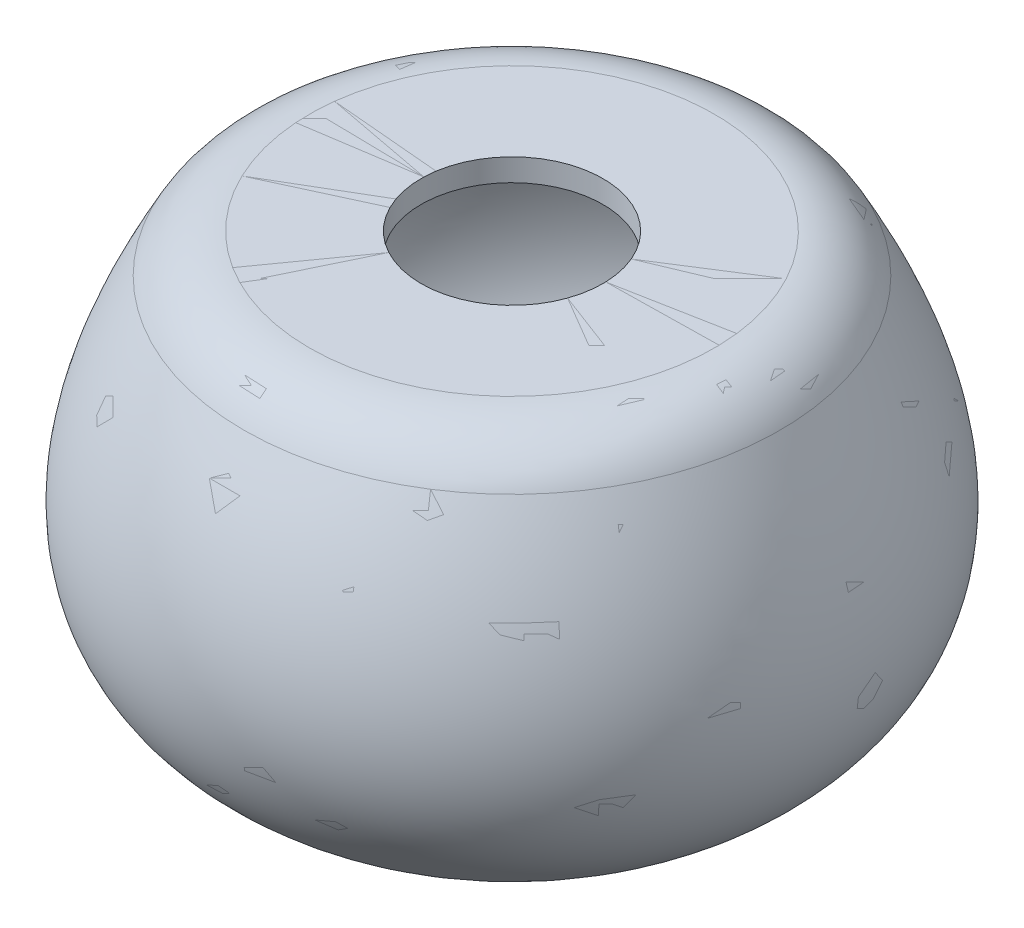
ISO-10303-21;
HEADER;
FILE_DESCRIPTION(('STEP AP214'),'2;1');
FILE_NAME('part.step','',(''),(''),'','','');
FILE_SCHEMA(('AUTOMOTIVE_DESIGN { 1 0 10303 214 1 1 1 1 }'));
ENDSEC;
DATA;
#1=APPLICATION_CONTEXT('core data for automotive mechanical design processes');
#2=APPLICATION_PROTOCOL_DEFINITION('international standard','automotive_design',2000,#1);
#3=PRODUCT_CONTEXT('',#1,'mechanical');
#4=PRODUCT('Part','Part','',(#3));
#5=PRODUCT_RELATED_PRODUCT_CATEGORY('part','',(#4));
#6=PRODUCT_DEFINITION_FORMATION('','',#4);
#7=PRODUCT_DEFINITION_CONTEXT('part definition',#1,'design');
#8=PRODUCT_DEFINITION('design','',#6,#7);
#9=PRODUCT_DEFINITION_SHAPE('','',#8);
#10=(LENGTH_UNIT() NAMED_UNIT(*) SI_UNIT(.MILLI.,.METRE.));
#11=(NAMED_UNIT(*) PLANE_ANGLE_UNIT() SI_UNIT($,.RADIAN.));
#12=(NAMED_UNIT(*) SI_UNIT($,.STERADIAN.) SOLID_ANGLE_UNIT());
#13=UNCERTAINTY_MEASURE_WITH_UNIT(LENGTH_MEASURE(1.E-05),#10,'distance_accuracy_value','');
#14=(GEOMETRIC_REPRESENTATION_CONTEXT(3) GLOBAL_UNCERTAINTY_ASSIGNED_CONTEXT((#13)) GLOBAL_UNIT_ASSIGNED_CONTEXT((#10,
#11,#12)) REPRESENTATION_CONTEXT('',''));
#15=CARTESIAN_POINT('',(0.,0.,0.));
#16=DIRECTION('',(0.,0.,1.));
#17=DIRECTION('',(1.,0.,0.));
#18=AXIS2_PLACEMENT_3D('',#15,#16,#17);
#19=CARTESIAN_POINT('',(0.,32.7058837831267,0.));
#20=DIRECTION('',(0.,1.,0.));
#21=DIRECTION('',(0.,0.,1.));
#22=AXIS2_PLACEMENT_3D('',#19,#20,#21);
#23=CYLINDRICAL_SURFACE('',#22,12.1875699003161);
#24=CARTESIAN_POINT('',(0.,32.7058837831267,0.));
#25=DIRECTION('',(0.,1.,0.));
#26=DIRECTION('',(0.,0.,1.));
#27=AXIS2_PLACEMENT_3D('',#24,#25,#26);
#28=CIRCLE('',#27,12.1875699003161);
#29=CARTESIAN_POINT('',(0.,32.7058837831267,12.1875699003161));
#30=VERTEX_POINT('',#29);
#31=EDGE_CURVE('E14',#30,#30,#28,.T.);
#32=ORIENTED_EDGE('',*,*,#31,.T.);
#33=EDGE_LOOP('',(#32));
#34=FACE_BOUND('',#33,.T.);
#35=CARTESIAN_POINT('',(0.,29.7058837831267,0.));
#36=DIRECTION('',(0.,1.,0.));
#37=DIRECTION('',(0.,0.,1.));
#38=AXIS2_PLACEMENT_3D('',#35,#36,#37);
#39=CIRCLE('',#38,12.1875699003161);
#40=CARTESIAN_POINT('',(0.,29.7058837831267,12.1875699003161));
#41=VERTEX_POINT('',#40);
#42=EDGE_CURVE('E87',#41,#41,#39,.T.);
#43=ORIENTED_EDGE('',*,*,#42,.F.);
#44=EDGE_LOOP('',(#43));
#45=FACE_BOUND('',#44,.T.);
#46=ADVANCED_FACE('F58',(#34,#45),#23,.F.);
#47=CARTESIAN_POINT('',(-12.1875699003161,32.7058837831267,0.));
#48=DIRECTION('',(0.,1.,0.));
#49=DIRECTION('',(0.,0.,1.));
#50=AXIS2_PLACEMENT_3D('',#47,#48,#49);
#51=PLANE('',#50);
#52=CARTESIAN_POINT('',(0.,32.7058837831267,0.));
#53=DIRECTION('',(0.,1.,0.));
#54=DIRECTION('',(0.,0.,1.));
#55=AXIS2_PLACEMENT_3D('',#52,#53,#54);
#56=CIRCLE('',#55,27.1307643229796);
#57=CARTESIAN_POINT('',(0.,32.7058837831267,27.1307643229796));
#58=VERTEX_POINT('',#57);
#59=EDGE_CURVE('E69',#58,#58,#56,.T.);
#60=ORIENTED_EDGE('',*,*,#59,.T.);
#61=EDGE_LOOP('',(#60));
#62=FACE_BOUND('',#61,.T.);
#63=ORIENTED_EDGE('',*,*,#31,.F.);
#64=EDGE_LOOP('',(#63));
#65=FACE_BOUND('',#64,.T.);
#66=ADVANCED_FACE('F114',(#62,#65),#51,.T.);
#67=CARTESIAN_POINT('',(0.,22.7058837831267,0.));
#68=DIRECTION('',(0.,1.,0.));
#69=DIRECTION('',(0.,0.,1.));
#70=AXIS2_PLACEMENT_3D('',#67,#68,#69);
#71=TOROIDAL_SURFACE('',#70,27.1307643229796,10.);
#72=CARTESIAN_POINT('',(0.,27.5344617664717,0.));
#73=DIRECTION('',(0.,1.,0.));
#74=DIRECTION('',(0.,0.,1.));
#75=AXIS2_PLACEMENT_3D('',#72,#73,#74);
#76=CIRCLE('',#75,35.8877520846906);
#77=CARTESIAN_POINT('',(0.,27.5344617664717,35.8877520846906));
#78=VERTEX_POINT('',#77);
#79=EDGE_CURVE('E90',#78,#78,#76,.F.);
#80=ORIENTED_EDGE('',*,*,#79,.F.);
#81=EDGE_LOOP('',(#80));
#82=FACE_BOUND('',#81,.T.);
#83=ORIENTED_EDGE('',*,*,#59,.F.);
#84=EDGE_LOOP('',(#83));
#85=FACE_BOUND('',#84,.T.);
#86=ADVANCED_FACE('F111',(#82,#85),#71,.T.);
#87=CARTESIAN_POINT('',(-32.8601568198395,32.7058837831267,0.));
#88=CARTESIAN_POINT('',(-66.4637322359129,-21.6603005358724,0.));
#89=CARTESIAN_POINT('',(0.,-29.9764651818748,0.));
#90=B_SPLINE_CURVE_WITH_KNOTS('',2,(#87,#88,#89),.UNSPECIFIED.,.F.,.F.,(3,3),(0.,1.),.UNSPECIFIED.);
#91=CARTESIAN_POINT('',(0.,-36.5448515190839,0.));
#92=DIRECTION('',(0.,1.,0.));
#93=AXIS1_PLACEMENT('',#91,#92);
#94=SURFACE_OF_REVOLUTION('',#90,#93);
#95=ORIENTED_EDGE('',*,*,#79,.T.);
#96=EDGE_LOOP('',(#95));
#97=FACE_BOUND('',#96,.T.);
#98=CARTESIAN_POINT('',(0.,-29.9764651818748,0.));
#99=VERTEX_POINT('',#98);
#100=VERTEX_LOOP('',#99);
#101=FACE_BOUND('',#100,.T.);
#102=ADVANCED_FACE('F107',(#97,#101),#94,.F.);
#103=CARTESIAN_POINT('',(-12.1875699003161,29.7058837831267,0.));
#104=DIRECTION('',(0.,1.,0.));
#105=DIRECTION('',(0.,0.,1.));
#106=AXIS2_PLACEMENT_3D('',#103,#104,#105);
#107=PLANE('',#106);
#108=CARTESIAN_POINT('',(0.,29.7058837831267,0.));
#109=DIRECTION('',(0.,1.,0.));
#110=DIRECTION('',(0.,0.,1.));
#111=AXIS2_PLACEMENT_3D('',#108,#109,#110);
#112=CIRCLE('',#111,27.1307643229796);
#113=CARTESIAN_POINT('',(0.,29.7058837831267,27.1307643229796));
#114=VERTEX_POINT('',#113);
#115=EDGE_CURVE('E84',#114,#114,#112,.T.);
#116=ORIENTED_EDGE('',*,*,#115,.F.);
#117=EDGE_LOOP('',(#116));
#118=FACE_BOUND('',#117,.T.);
#119=ORIENTED_EDGE('',*,*,#42,.T.);
#120=EDGE_LOOP('',(#119));
#121=FACE_BOUND('',#120,.T.);
#122=ADVANCED_FACE('F110',(#118,#121),#107,.F.);
#123=CARTESIAN_POINT('',(0.,22.7058837831267,0.));
#124=DIRECTION('',(0.,1.,0.));
#125=DIRECTION('',(0.,0.,1.));
#126=AXIS2_PLACEMENT_3D('',#123,#124,#125);
#127=TOROIDAL_SURFACE('',#126,27.1307643229796,7.);
#128=CARTESIAN_POINT('',(0.,26.0858883714682,0.));
#129=DIRECTION('',(0.,1.,0.));
#130=DIRECTION('',(-1.,0.,0.));
#131=AXIS2_PLACEMENT_3D('',#128,#129,#130);
#132=CIRCLE('',#131,33.2606557561773);
#133=CARTESIAN_POINT('',(-33.2606557561773,26.0858883714682,0.));
#134=VERTEX_POINT('',#133);
#135=EDGE_CURVE('E82',#134,#134,#132,.F.);
#136=ORIENTED_EDGE('',*,*,#135,.T.);
#137=EDGE_LOOP('',(#136));
#138=FACE_BOUND('',#137,.T.);
#139=ORIENTED_EDGE('',*,*,#115,.T.);
#140=EDGE_LOOP('',(#139));
#141=FACE_BOUND('',#140,.T.);
#142=ADVANCED_FACE('F78',(#138,#141),#127,.F.);
#143=CARTESIAN_POINT('',(-32.8601568198395,32.7058837831267,0.));
#144=CARTESIAN_POINT('',(-66.3674895074952,-21.5045924051829,0.));
#145=CARTESIAN_POINT('',(-0.379891682232447,-29.9284514156055,0.));
#146=B_SPLINE_CURVE_WITH_KNOTS('',2,(#143,#144,#145),.UNSPECIFIED.,.F.,.F.,(3,3),(0.,
0.997135937851074),.UNSPECIFIED.);
#147=CARTESIAN_POINT('',(0.,-36.5448515190839,0.));
#148=DIRECTION('',(0.,1.,0.));
#149=AXIS1_PLACEMENT('',#147,#148);
#150=SURFACE_OF_REVOLUTION('',#146,#149);
#151=OFFSET_SURFACE('',#150,3.,.F.);
#152=CARTESIAN_POINT('',(0.,-26.9526015689615,0.));
#153=VERTEX_POINT('',#152);
#154=VERTEX_LOOP('',#153);
#155=FACE_BOUND('',#154,.T.);
#156=ORIENTED_EDGE('',*,*,#135,.F.);
#157=EDGE_LOOP('',(#156));
#158=FACE_BOUND('',#157,.T.);
#159=ADVANCED_FACE('F75',(#155,#158),#151,.T.);
#160=CLOSED_SHELL('',(#46,#66,#86,#102,#122,#142,#159));
#161=MANIFOLD_SOLID_BREP('B2',#160);
#162=CARTESIAN_POINT('',(-12.1875699003161,32.7058837831267,0.));
#163=DIRECTION('',(0.,1.,0.));
#164=DIRECTION('',(0.,0.,1.));
#165=AXIS2_PLACEMENT_3D('',#162,#163,#164);
#166=PLANE('',#165);
#167=CARTESIAN_POINT('',(0.,32.7058837831267,0.));
#168=DIRECTION('',(0.,1.,0.));
#169=DIRECTION('',(0.,0.,1.));
#170=AXIS2_PLACEMENT_3D('',#167,#168,#169);
#171=CIRCLE('',#170,27.1307643229796);
#172=CARTESIAN_POINT('',(0.,32.7058837831267,27.1307643229796));
#173=VERTEX_POINT('',#172);
#174=EDGE_CURVE('E185',#173,#173,#171,.T.);
#175=ORIENTED_EDGE('',*,*,#174,.T.);
#176=EDGE_LOOP('',(#175));
#177=FACE_BOUND('',#176,.T.);
#178=CARTESIAN_POINT('',(0.,32.7058837831267,0.));
#179=DIRECTION('',(0.,1.,0.));
#180=DIRECTION('',(0.,0.,1.));
#181=AXIS2_PLACEMENT_3D('',#178,#179,#180);
#182=CIRCLE('',#181,12.1875699003161);
#183=CARTESIAN_POINT('',(0.,32.7058837831267,12.1875699003161));
#184=VERTEX_POINT('',#183);
#185=EDGE_CURVE('E203',#184,#184,#182,.T.);
#186=ORIENTED_EDGE('',*,*,#185,.F.);
#187=EDGE_LOOP('',(#186));
#188=FACE_BOUND('',#187,.T.);
#189=ADVANCED_FACE('F180',(#177,#188),#166,.T.);
#190=CARTESIAN_POINT('',(-32.8601568198395,32.7058837831267,0.));
#191=CARTESIAN_POINT('',(-66.4637322359129,-21.6603005358724,0.));
#192=CARTESIAN_POINT('',(0.,-29.9764651818748,0.));
#193=B_SPLINE_CURVE_WITH_KNOTS('',2,(#190,#191,#192),.UNSPECIFIED.,.F.,.F.,(3,3),(0.,1.),.UNSPECIFIED.);
#194=CARTESIAN_POINT('',(0.,-36.5448515190839,0.));
#195=DIRECTION('',(0.,1.,0.));
#196=AXIS1_PLACEMENT('',#194,#195);
#197=SURFACE_OF_REVOLUTION('',#193,#196);
#198=CARTESIAN_POINT('',(0.,27.5344617664717,0.));
#199=DIRECTION('',(0.,1.,0.));
#200=DIRECTION('',(0.,0.,1.));
#201=AXIS2_PLACEMENT_3D('',#198,#199,#200);
#202=CIRCLE('',#201,35.8877520846906);
#203=CARTESIAN_POINT('',(0.,27.5344617664717,35.8877520846906));
#204=VERTEX_POINT('',#203);
#205=EDGE_CURVE('E56',#204,#204,#202,.F.);
#206=ORIENTED_EDGE('',*,*,#205,.T.);
#207=EDGE_LOOP('',(#206));
#208=FACE_BOUND('',#207,.T.);
#209=CARTESIAN_POINT('',(0.,-29.9764651818748,0.));
#210=VERTEX_POINT('',#209);
#211=VERTEX_LOOP('',#210);
#212=FACE_BOUND('',#211,.T.);
#213=ADVANCED_FACE('F188',(#208,#212),#197,.F.);
#214=CARTESIAN_POINT('',(0.,22.7058837831267,0.));
#215=DIRECTION('',(0.,1.,0.));
#216=DIRECTION('',(0.,0.,1.));
#217=AXIS2_PLACEMENT_3D('',#214,#215,#216);
#218=TOROIDAL_SURFACE('',#217,27.1307643229796,10.);
#219=ORIENTED_EDGE('',*,*,#205,.F.);
#220=EDGE_LOOP('',(#219));
#221=FACE_BOUND('',#220,.T.);
#222=ORIENTED_EDGE('',*,*,#174,.F.);
#223=EDGE_LOOP('',(#222));
#224=FACE_BOUND('',#223,.T.);
#225=ADVANCED_FACE('F181',(#221,#224),#218,.T.);
#226=OPEN_SHELL('',(#189,#213,#225));
#227=SHELL_BASED_SURFACE_MODEL('B8',(#226));
#228=ADVANCED_BREP_SHAPE_REPRESENTATION('',(#18,#161),#14);
#229=MANIFOLD_SURFACE_SHAPE_REPRESENTATION('',(#18,#227),#14);
#230=SHAPE_REPRESENTATION('',(#18),#14);
#231=SHAPE_DEFINITION_REPRESENTATION(#9,#230);
#232=SHAPE_REPRESENTATION_RELATIONSHIP('','',#230,#228);
#233=SHAPE_REPRESENTATION_RELATIONSHIP('','',#230,#229);
ENDSEC;
END-ISO-10303-21;
